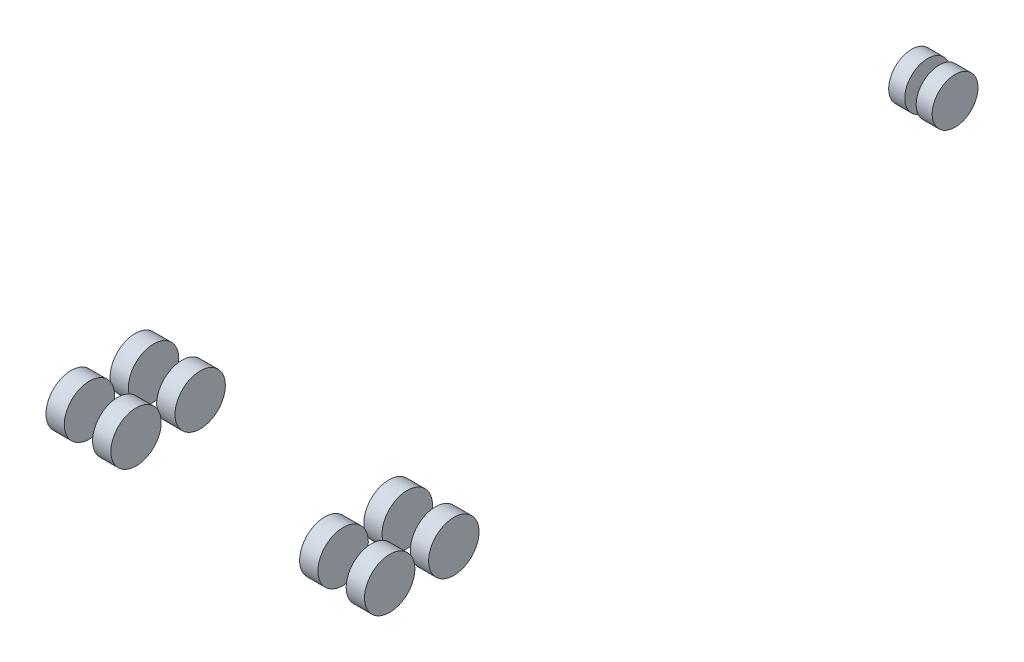
ISO-10303-21;
HEADER;
FILE_DESCRIPTION(('STEP AP214'),'2;1');
FILE_NAME('part.step','',(''),(''),'','','');
FILE_SCHEMA(('AUTOMOTIVE_DESIGN { 1 0 10303 214 1 1 1 1 }'));
ENDSEC;
DATA;
#1=APPLICATION_CONTEXT('core data for automotive mechanical design processes');
#2=APPLICATION_PROTOCOL_DEFINITION('international standard','automotive_design',2000,#1);
#3=PRODUCT_CONTEXT('',#1,'mechanical');
#4=PRODUCT('Part','Part','',(#3));
#5=PRODUCT_RELATED_PRODUCT_CATEGORY('part','',(#4));
#6=PRODUCT_DEFINITION_FORMATION('','',#4);
#7=PRODUCT_DEFINITION_CONTEXT('part definition',#1,'design');
#8=PRODUCT_DEFINITION('design','',#6,#7);
#9=PRODUCT_DEFINITION_SHAPE('','',#8);
#10=(LENGTH_UNIT() NAMED_UNIT(*) SI_UNIT(.MILLI.,.METRE.));
#11=(NAMED_UNIT(*) PLANE_ANGLE_UNIT() SI_UNIT($,.RADIAN.));
#12=(NAMED_UNIT(*) SI_UNIT($,.STERADIAN.) SOLID_ANGLE_UNIT());
#13=UNCERTAINTY_MEASURE_WITH_UNIT(LENGTH_MEASURE(1.E-05),#10,'distance_accuracy_value','');
#14=(GEOMETRIC_REPRESENTATION_CONTEXT(3) GLOBAL_UNCERTAINTY_ASSIGNED_CONTEXT((#13)) GLOBAL_UNIT_ASSIGNED_CONTEXT((#10,
#11,#12)) REPRESENTATION_CONTEXT('',''));
#15=CARTESIAN_POINT('',(0.,0.,0.));
#16=DIRECTION('',(0.,0.,1.));
#17=DIRECTION('',(1.,0.,0.));
#18=AXIS2_PLACEMENT_3D('',#15,#16,#17);
#19=CARTESIAN_POINT('',(127.,508.,-12192.));
#20=DIRECTION('',(1.,0.,0.));
#21=DIRECTION('',(0.,0.,-1.));
#22=AXIS2_PLACEMENT_3D('',#19,#20,#21);
#23=CYLINDRICAL_SURFACE('',#22,507.999999999999);
#24=CARTESIAN_POINT('',(127.,508.,-12192.));
#25=DIRECTION('',(1.,0.,0.));
#26=DIRECTION('',(0.,0.,-1.));
#27=AXIS2_PLACEMENT_3D('',#24,#25,#26);
#28=CIRCLE('',#27,507.999999999999);
#29=CARTESIAN_POINT('',(127.,508.,-12700.));
#30=VERTEX_POINT('',#29);
#31=EDGE_CURVE('E11',#30,#30,#28,.T.);
#32=CARTESIAN_POINT('',(482.6,508.,-12192.));
#33=DIRECTION('',(1.,0.,0.));
#34=DIRECTION('',(0.,0.,-1.));
#35=AXIS2_PLACEMENT_3D('',#32,#33,#34);
#36=CIRCLE('',#35,507.999999999999);
#37=CARTESIAN_POINT('',(482.6,508.,-12700.));
#38=VERTEX_POINT('',#37);
#39=EDGE_CURVE('E50',#38,#38,#36,.T.);
#40=CARTESIAN_POINT('',(127.,508.,-12700.));
#41=CARTESIAN_POINT('',(130.704166666667,508.,-12700.));
#42=CARTESIAN_POINT('',(134.408333333333,508.,-12700.));
#43=CARTESIAN_POINT('',(141.816666666667,508.,-12700.));
#44=CARTESIAN_POINT('',(145.520833333333,508.,-12700.));
#45=CARTESIAN_POINT('',(152.929166666667,508.,-12700.));
#46=CARTESIAN_POINT('',(156.633333333333,508.,-12700.));
#47=CARTESIAN_POINT('',(164.041666666667,508.,-12700.));
#48=CARTESIAN_POINT('',(167.745833333333,508.,-12700.));
#49=CARTESIAN_POINT('',(175.154166666667,508.,-12700.));
#50=CARTESIAN_POINT('',(178.858333333333,508.,-12700.));
#51=CARTESIAN_POINT('',(186.266666666667,508.,-12700.));
#52=CARTESIAN_POINT('',(189.970833333333,508.,-12700.));
#53=CARTESIAN_POINT('',(197.379166666667,508.,-12700.));
#54=CARTESIAN_POINT('',(201.083333333333,508.,-12700.));
#55=CARTESIAN_POINT('',(208.491666666667,508.,-12700.));
#56=CARTESIAN_POINT('',(212.195833333333,508.,-12700.));
#57=CARTESIAN_POINT('',(219.604166666667,508.,-12700.));
#58=CARTESIAN_POINT('',(223.308333333333,508.,-12700.));
#59=CARTESIAN_POINT('',(230.716666666667,508.,-12700.));
#60=CARTESIAN_POINT('',(234.420833333333,508.,-12700.));
#61=CARTESIAN_POINT('',(241.829166666667,508.,-12700.));
#62=CARTESIAN_POINT('',(245.533333333333,508.,-12700.));
#63=CARTESIAN_POINT('',(252.941666666667,508.,-12700.));
#64=CARTESIAN_POINT('',(256.645833333333,508.,-12700.));
#65=CARTESIAN_POINT('',(264.054166666667,508.,-12700.));
#66=CARTESIAN_POINT('',(267.758333333333,508.,-12700.));
#67=CARTESIAN_POINT('',(275.166666666667,508.,-12700.));
#68=CARTESIAN_POINT('',(278.870833333333,508.,-12700.));
#69=CARTESIAN_POINT('',(286.279166666667,508.,-12700.));
#70=CARTESIAN_POINT('',(289.983333333333,508.,-12700.));
#71=CARTESIAN_POINT('',(297.391666666667,508.,-12700.));
#72=CARTESIAN_POINT('',(301.095833333333,508.,-12700.));
#73=CARTESIAN_POINT('',(308.504166666667,508.,-12700.));
#74=CARTESIAN_POINT('',(312.208333333333,508.,-12700.));
#75=CARTESIAN_POINT('',(319.616666666667,508.,-12700.));
#76=CARTESIAN_POINT('',(323.320833333333,508.,-12700.));
#77=CARTESIAN_POINT('',(330.729166666667,508.,-12700.));
#78=CARTESIAN_POINT('',(334.433333333333,508.,-12700.));
#79=CARTESIAN_POINT('',(341.841666666667,508.,-12700.));
#80=CARTESIAN_POINT('',(345.545833333333,508.,-12700.));
#81=CARTESIAN_POINT('',(352.954166666667,508.,-12700.));
#82=CARTESIAN_POINT('',(356.658333333333,508.,-12700.));
#83=CARTESIAN_POINT('',(364.066666666667,508.,-12700.));
#84=CARTESIAN_POINT('',(367.770833333333,508.,-12700.));
#85=CARTESIAN_POINT('',(375.179166666667,508.,-12700.));
#86=CARTESIAN_POINT('',(378.883333333333,508.,-12700.));
#87=CARTESIAN_POINT('',(386.291666666667,508.,-12700.));
#88=CARTESIAN_POINT('',(389.995833333333,508.,-12700.));
#89=CARTESIAN_POINT('',(397.404166666667,508.,-12700.));
#90=CARTESIAN_POINT('',(401.108333333333,508.,-12700.));
#91=CARTESIAN_POINT('',(408.516666666667,508.,-12700.));
#92=CARTESIAN_POINT('',(412.220833333333,508.,-12700.));
#93=CARTESIAN_POINT('',(419.629166666667,508.,-12700.));
#94=CARTESIAN_POINT('',(423.333333333333,508.,-12700.));
#95=CARTESIAN_POINT('',(430.741666666667,508.,-12700.));
#96=CARTESIAN_POINT('',(434.445833333333,508.,-12700.));
#97=CARTESIAN_POINT('',(441.854166666667,508.,-12700.));
#98=CARTESIAN_POINT('',(445.558333333333,508.,-12700.));
#99=CARTESIAN_POINT('',(452.966666666667,508.,-12700.));
#100=CARTESIAN_POINT('',(456.670833333333,508.,-12700.));
#101=CARTESIAN_POINT('',(464.079166666667,508.,-12700.));
#102=CARTESIAN_POINT('',(467.783333333333,508.,-12700.));
#103=CARTESIAN_POINT('',(475.191666666667,508.,-12700.));
#104=CARTESIAN_POINT('',(478.895833333333,508.,-12700.));
#105=CARTESIAN_POINT('',(482.6,508.,-12700.));
#106=B_SPLINE_CURVE_WITH_KNOTS('',3,(#40,#41,#42,#43,#44,#45,#46,#47,#48,#49,#50,#51,#52,#53,
#54,#55,#56,#57,#58,#59,#60,#61,#62,#63,#64,#65,#66,#67,#68,#69,#70,#71,#72,#73,#74,#75,#76,#77,
#78,#79,#80,#81,#82,#83,#84,#85,#86,#87,#88,#89,#90,#91,#92,#93,#94,#95,#96,#97,#98,#99,#100,
#101,#102,#103,#104,#105),.UNSPECIFIED.,.F.,.F.,(4,2,2,2,2,2,2,2,2,2,2,2,2,2,2,2,2,2,2,2,2,2,2,
2,2,2,2,2,2,2,2,2,4),(0.,11.1125,22.225,33.3375,44.45,55.5625,66.675,77.7875,88.9,100.0125,
111.125,122.2375,133.35,144.4625,155.575,166.6875,177.8,188.9125,200.025,211.1375,222.25,
233.3625,244.475,255.5875,266.7,277.8125,288.925,300.0375,311.15,322.2625,333.375,344.4875,
355.6),.UNSPECIFIED.);
#107=EDGE_CURVE('BSEAM44',#30,#38,#106,.T.);
#108=ORIENTED_EDGE('',*,*,#31,.T.);
#109=ORIENTED_EDGE('',*,*,#39,.F.);
#110=ORIENTED_EDGE('',*,*,#107,.T.);
#111=ORIENTED_EDGE('',*,*,#107,.F.);
#112=EDGE_LOOP('',(#108,#110,#109,#111));
#113=FACE_BOUND('',#112,.T.);
#114=ADVANCED_FACE('F44',(#113),#23,.T.);
#115=CARTESIAN_POINT('',(127.,508.,-12192.));
#116=DIRECTION('',(1.,0.,0.));
#117=DIRECTION('',(0.,0.,-1.));
#118=AXIS2_PLACEMENT_3D('',#115,#116,#117);
#119=PLANE('',#118);
#120=ORIENTED_EDGE('',*,*,#31,.F.);
#121=EDGE_LOOP('',(#120));
#122=FACE_BOUND('',#121,.T.);
#123=ADVANCED_FACE('F59',(#122),#119,.F.);
#124=CARTESIAN_POINT('',(482.6,508.,-12192.));
#125=DIRECTION('',(1.,0.,0.));
#126=DIRECTION('',(0.,0.,-1.));
#127=AXIS2_PLACEMENT_3D('',#124,#125,#126);
#128=PLANE('',#127);
#129=ORIENTED_EDGE('',*,*,#39,.T.);
#130=EDGE_LOOP('',(#129));
#131=FACE_BOUND('',#130,.T.);
#132=ADVANCED_FACE('F56',(#131),#128,.T.);
#133=CLOSED_SHELL('',(#114,#123,#132));
#134=MANIFOLD_SOLID_BREP('B2',#133);
#135=CARTESIAN_POINT('',(-482.6,508.,-12192.));
#136=DIRECTION('',(1.,0.,0.));
#137=DIRECTION('',(0.,0.,-1.));
#138=AXIS2_PLACEMENT_3D('',#135,#136,#137);
#139=CYLINDRICAL_SURFACE('',#138,507.999999999999);
#140=CARTESIAN_POINT('',(-482.6,508.,-12192.));
#141=DIRECTION('',(1.,0.,0.));
#142=DIRECTION('',(0.,0.,-1.));
#143=AXIS2_PLACEMENT_3D('',#140,#141,#142);
#144=CIRCLE('',#143,507.999999999999);
#145=CARTESIAN_POINT('',(-482.6,508.,-12700.));
#146=VERTEX_POINT('',#145);
#147=EDGE_CURVE('E43',#146,#146,#144,.T.);
#148=CARTESIAN_POINT('',(-127.,508.,-12192.));
#149=DIRECTION('',(1.,0.,0.));
#150=DIRECTION('',(0.,0.,-1.));
#151=AXIS2_PLACEMENT_3D('',#148,#149,#150);
#152=CIRCLE('',#151,507.999999999999);
#153=CARTESIAN_POINT('',(-127.,508.,-12700.));
#154=VERTEX_POINT('',#153);
#155=EDGE_CURVE('E105',#154,#154,#152,.T.);
#156=CARTESIAN_POINT('',(-482.6,508.,-12700.));
#157=CARTESIAN_POINT('',(-478.895833333333,508.,-12700.));
#158=CARTESIAN_POINT('',(-475.191666666667,508.,-12700.));
#159=CARTESIAN_POINT('',(-467.783333333333,508.,-12700.));
#160=CARTESIAN_POINT('',(-464.079166666667,508.,-12700.));
#161=CARTESIAN_POINT('',(-456.670833333333,508.,-12700.));
#162=CARTESIAN_POINT('',(-452.966666666667,508.,-12700.));
#163=CARTESIAN_POINT('',(-445.558333333333,508.,-12700.));
#164=CARTESIAN_POINT('',(-441.854166666667,508.,-12700.));
#165=CARTESIAN_POINT('',(-434.445833333333,508.,-12700.));
#166=CARTESIAN_POINT('',(-430.741666666667,508.,-12700.));
#167=CARTESIAN_POINT('',(-423.333333333333,508.,-12700.));
#168=CARTESIAN_POINT('',(-419.629166666667,508.,-12700.));
#169=CARTESIAN_POINT('',(-412.220833333333,508.,-12700.));
#170=CARTESIAN_POINT('',(-408.516666666667,508.,-12700.));
#171=CARTESIAN_POINT('',(-401.108333333333,508.,-12700.));
#172=CARTESIAN_POINT('',(-397.404166666667,508.,-12700.));
#173=CARTESIAN_POINT('',(-389.995833333333,508.,-12700.));
#174=CARTESIAN_POINT('',(-386.291666666667,508.,-12700.));
#175=CARTESIAN_POINT('',(-378.883333333333,508.,-12700.));
#176=CARTESIAN_POINT('',(-375.179166666667,508.,-12700.));
#177=CARTESIAN_POINT('',(-367.770833333333,508.,-12700.));
#178=CARTESIAN_POINT('',(-364.066666666667,508.,-12700.));
#179=CARTESIAN_POINT('',(-356.658333333333,508.,-12700.));
#180=CARTESIAN_POINT('',(-352.954166666667,508.,-12700.));
#181=CARTESIAN_POINT('',(-345.545833333333,508.,-12700.));
#182=CARTESIAN_POINT('',(-341.841666666667,508.,-12700.));
#183=CARTESIAN_POINT('',(-334.433333333333,508.,-12700.));
#184=CARTESIAN_POINT('',(-330.729166666667,508.,-12700.));
#185=CARTESIAN_POINT('',(-323.320833333333,508.,-12700.));
#186=CARTESIAN_POINT('',(-319.616666666667,508.,-12700.));
#187=CARTESIAN_POINT('',(-312.208333333333,508.,-12700.));
#188=CARTESIAN_POINT('',(-308.504166666667,508.,-12700.));
#189=CARTESIAN_POINT('',(-301.095833333333,508.,-12700.));
#190=CARTESIAN_POINT('',(-297.391666666667,508.,-12700.));
#191=CARTESIAN_POINT('',(-289.983333333333,508.,-12700.));
#192=CARTESIAN_POINT('',(-286.279166666667,508.,-12700.));
#193=CARTESIAN_POINT('',(-278.870833333333,508.,-12700.));
#194=CARTESIAN_POINT('',(-275.166666666667,508.,-12700.));
#195=CARTESIAN_POINT('',(-267.758333333333,508.,-12700.));
#196=CARTESIAN_POINT('',(-264.054166666667,508.,-12700.));
#197=CARTESIAN_POINT('',(-256.645833333333,508.,-12700.));
#198=CARTESIAN_POINT('',(-252.941666666667,508.,-12700.));
#199=CARTESIAN_POINT('',(-245.533333333333,508.,-12700.));
#200=CARTESIAN_POINT('',(-241.829166666667,508.,-12700.));
#201=CARTESIAN_POINT('',(-234.420833333333,508.,-12700.));
#202=CARTESIAN_POINT('',(-230.716666666667,508.,-12700.));
#203=CARTESIAN_POINT('',(-223.308333333333,508.,-12700.));
#204=CARTESIAN_POINT('',(-219.604166666667,508.,-12700.));
#205=CARTESIAN_POINT('',(-212.195833333333,508.,-12700.));
#206=CARTESIAN_POINT('',(-208.491666666667,508.,-12700.));
#207=CARTESIAN_POINT('',(-201.083333333333,508.,-12700.));
#208=CARTESIAN_POINT('',(-197.379166666667,508.,-12700.));
#209=CARTESIAN_POINT('',(-189.970833333333,508.,-12700.));
#210=CARTESIAN_POINT('',(-186.266666666667,508.,-12700.));
#211=CARTESIAN_POINT('',(-178.858333333333,508.,-12700.));
#212=CARTESIAN_POINT('',(-175.154166666667,508.,-12700.));
#213=CARTESIAN_POINT('',(-167.745833333333,508.,-12700.));
#214=CARTESIAN_POINT('',(-164.041666666667,508.,-12700.));
#215=CARTESIAN_POINT('',(-156.633333333333,508.,-12700.));
#216=CARTESIAN_POINT('',(-152.929166666667,508.,-12700.));
#217=CARTESIAN_POINT('',(-145.520833333333,508.,-12700.));
#218=CARTESIAN_POINT('',(-141.816666666667,508.,-12700.));
#219=CARTESIAN_POINT('',(-134.408333333333,508.,-12700.));
#220=CARTESIAN_POINT('',(-130.704166666667,508.,-12700.));
#221=CARTESIAN_POINT('',(-127.,508.,-12700.));
#222=B_SPLINE_CURVE_WITH_KNOTS('',3,(#156,#157,#158,#159,#160,#161,#162,#163,#164,#165,#166,
#167,#168,#169,#170,#171,#172,#173,#174,#175,#176,#177,#178,#179,#180,#181,#182,#183,#184,#185,
#186,#187,#188,#189,#190,#191,#192,#193,#194,#195,#196,#197,#198,#199,#200,#201,#202,#203,#204,
#205,#206,#207,#208,#209,#210,#211,#212,#213,#214,#215,#216,#217,#218,#219,#220,#221),
.UNSPECIFIED.,.F.,.F.,(4,2,2,2,2,2,2,2,2,2,2,2,2,2,2,2,2,2,2,2,2,2,2,2,2,2,2,2,2,2,2,2,4),(0.,
11.1125,22.2250000000001,33.3375,44.45,55.5625000000001,66.675,77.7875000000001,
88.9000000000001,100.0125,111.125,122.2375,133.35,144.4625,155.575,166.6875,177.8,188.9125,
200.025,211.1375,222.25,233.3625,244.475,255.5875,266.7,277.8125,288.925,300.0375,311.15,
322.2625,333.375,344.4875,355.6),.UNSPECIFIED.);
#223=EDGE_CURVE('BSEAM99',#146,#154,#222,.T.);
#224=ORIENTED_EDGE('',*,*,#147,.T.);
#225=ORIENTED_EDGE('',*,*,#155,.F.);
#226=ORIENTED_EDGE('',*,*,#223,.T.);
#227=ORIENTED_EDGE('',*,*,#223,.F.);
#228=EDGE_LOOP('',(#224,#226,#225,#227));
#229=FACE_BOUND('',#228,.T.);
#230=ADVANCED_FACE('F99',(#229),#139,.T.);
#231=CARTESIAN_POINT('',(-482.6,508.,-12192.));
#232=DIRECTION('',(1.,0.,0.));
#233=DIRECTION('',(0.,0.,-1.));
#234=AXIS2_PLACEMENT_3D('',#231,#232,#233);
#235=PLANE('',#234);
#236=ORIENTED_EDGE('',*,*,#147,.F.);
#237=EDGE_LOOP('',(#236));
#238=FACE_BOUND('',#237,.T.);
#239=ADVANCED_FACE('F114',(#238),#235,.F.);
#240=CARTESIAN_POINT('',(-127.,508.,-12192.));
#241=DIRECTION('',(1.,0.,0.));
#242=DIRECTION('',(0.,0.,-1.));
#243=AXIS2_PLACEMENT_3D('',#240,#241,#242);
#244=PLANE('',#243);
#245=ORIENTED_EDGE('',*,*,#155,.T.);
#246=EDGE_LOOP('',(#245));
#247=FACE_BOUND('',#246,.T.);
#248=ADVANCED_FACE('F111',(#247),#244,.T.);
#249=CLOSED_SHELL('',(#230,#239,#248));
#250=MANIFOLD_SOLID_BREP('B6',#249);
#251=CARTESIAN_POINT('',(3126.85028932855,558.8,1978.3552));
#252=DIRECTION('',(1.,0.,0.));
#253=DIRECTION('',(0.,0.,-1.));
#254=AXIS2_PLACEMENT_3D('',#251,#252,#253);
#255=CYLINDRICAL_SURFACE('',#254,558.8);
#256=CARTESIAN_POINT('',(3126.85028932855,558.8,1978.3552));
#257=DIRECTION('',(1.,0.,0.));
#258=DIRECTION('',(0.,0.,-1.));
#259=AXIS2_PLACEMENT_3D('',#256,#257,#258);
#260=CIRCLE('',#259,558.8);
#261=CARTESIAN_POINT('',(3126.85028932855,558.8,1419.5552));
#262=VERTEX_POINT('',#261);
#263=EDGE_CURVE('E161',#262,#262,#260,.T.);
#264=ORIENTED_EDGE('',*,*,#263,.T.);
#265=EDGE_LOOP('',(#264));
#266=FACE_BOUND('',#265,.T.);
#267=CARTESIAN_POINT('',(3533.25028932855,558.8,1978.3552));
#268=DIRECTION('',(1.,0.,0.));
#269=DIRECTION('',(0.,0.,-1.));
#270=AXIS2_PLACEMENT_3D('',#267,#268,#269);
#271=CIRCLE('',#270,558.8);
#272=CARTESIAN_POINT('',(3533.25028932855,558.8,1419.5552));
#273=VERTEX_POINT('',#272);
#274=EDGE_CURVE('E98',#273,#273,#271,.T.);
#275=ORIENTED_EDGE('',*,*,#274,.F.);
#276=EDGE_LOOP('',(#275));
#277=FACE_BOUND('',#276,.T.);
#278=ADVANCED_FACE('F154',(#266,#277),#255,.T.);
#279=CARTESIAN_POINT('',(3126.85028932855,558.8,1978.3552));
#280=DIRECTION('',(1.,0.,0.));
#281=DIRECTION('',(0.,0.,-1.));
#282=AXIS2_PLACEMENT_3D('',#279,#280,#281);
#283=PLANE('',#282);
#284=ORIENTED_EDGE('',*,*,#263,.F.);
#285=EDGE_LOOP('',(#284));
#286=FACE_BOUND('',#285,.T.);
#287=ADVANCED_FACE('F169',(#286),#283,.F.);
#288=CARTESIAN_POINT('',(3533.25028932855,558.8,1978.3552));
#289=DIRECTION('',(1.,0.,0.));
#290=DIRECTION('',(0.,0.,-1.));
#291=AXIS2_PLACEMENT_3D('',#288,#289,#290);
#292=PLANE('',#291);
#293=ORIENTED_EDGE('',*,*,#274,.T.);
#294=EDGE_LOOP('',(#293));
#295=FACE_BOUND('',#294,.T.);
#296=ADVANCED_FACE('F156',(#295),#292,.T.);
#297=CLOSED_SHELL('',(#278,#287,#296));
#298=MANIFOLD_SOLID_BREP('B38',#297);
#299=CARTESIAN_POINT('',(3126.85028932855,558.8,3400.7552));
#300=DIRECTION('',(1.,0.,0.));
#301=DIRECTION('',(0.,0.,-1.));
#302=AXIS2_PLACEMENT_3D('',#299,#300,#301);
#303=CYLINDRICAL_SURFACE('',#302,558.8);
#304=CARTESIAN_POINT('',(3126.85028932855,558.8,3400.7552));
#305=DIRECTION('',(1.,0.,0.));
#306=DIRECTION('',(0.,0.,-1.));
#307=AXIS2_PLACEMENT_3D('',#304,#305,#306);
#308=CIRCLE('',#307,558.8);
#309=CARTESIAN_POINT('',(3126.85028932855,558.8,2841.9552));
#310=VERTEX_POINT('',#309);
#311=EDGE_CURVE('E153',#310,#310,#308,.T.);
#312=ORIENTED_EDGE('',*,*,#311,.T.);
#313=EDGE_LOOP('',(#312));
#314=FACE_BOUND('',#313,.T.);
#315=CARTESIAN_POINT('',(3533.25028932855,558.8,3400.7552));
#316=DIRECTION('',(1.,0.,0.));
#317=DIRECTION('',(0.,0.,-1.));
#318=AXIS2_PLACEMENT_3D('',#315,#316,#317);
#319=CIRCLE('',#318,558.8);
#320=CARTESIAN_POINT('',(3533.25028932855,558.8,2841.9552));
#321=VERTEX_POINT('',#320);
#322=EDGE_CURVE('E215',#321,#321,#319,.T.);
#323=ORIENTED_EDGE('',*,*,#322,.F.);
#324=EDGE_LOOP('',(#323));
#325=FACE_BOUND('',#324,.T.);
#326=ADVANCED_FACE('F209',(#314,#325),#303,.T.);
#327=CARTESIAN_POINT('',(3126.85028932855,558.8,3400.7552));
#328=DIRECTION('',(1.,0.,0.));
#329=DIRECTION('',(0.,0.,-1.));
#330=AXIS2_PLACEMENT_3D('',#327,#328,#329);
#331=PLANE('',#330);
#332=ORIENTED_EDGE('',*,*,#311,.F.);
#333=EDGE_LOOP('',(#332));
#334=FACE_BOUND('',#333,.T.);
#335=ADVANCED_FACE('F224',(#334),#331,.F.);
#336=CARTESIAN_POINT('',(3533.25028932855,558.8,3400.7552));
#337=DIRECTION('',(1.,0.,0.));
#338=DIRECTION('',(0.,0.,-1.));
#339=AXIS2_PLACEMENT_3D('',#336,#337,#338);
#340=PLANE('',#339);
#341=ORIENTED_EDGE('',*,*,#322,.T.);
#342=EDGE_LOOP('',(#341));
#343=FACE_BOUND('',#342,.T.);
#344=ADVANCED_FACE('F221',(#343),#340,.T.);
#345=CLOSED_SHELL('',(#326,#335,#344));
#346=MANIFOLD_SOLID_BREP('B93',#345);
#347=CARTESIAN_POINT('',(2093.41619749383,558.8,3400.7552));
#348=DIRECTION('',(1.,0.,0.));
#349=DIRECTION('',(0.,0.,-1.));
#350=AXIS2_PLACEMENT_3D('',#347,#348,#349);
#351=CYLINDRICAL_SURFACE('',#350,558.8);
#352=CARTESIAN_POINT('',(2093.41619749383,558.8,3400.7552));
#353=DIRECTION('',(1.,0.,0.));
#354=DIRECTION('',(0.,0.,-1.));
#355=AXIS2_PLACEMENT_3D('',#352,#353,#354);
#356=CIRCLE('',#355,558.8);
#357=CARTESIAN_POINT('',(2093.41619749383,558.8,2841.9552));
#358=VERTEX_POINT('',#357);
#359=EDGE_CURVE('E271',#358,#358,#356,.T.);
#360=ORIENTED_EDGE('',*,*,#359,.T.);
#361=EDGE_LOOP('',(#360));
#362=FACE_BOUND('',#361,.T.);
#363=CARTESIAN_POINT('',(2499.81619749383,558.8,3400.7552));
#364=DIRECTION('',(1.,0.,0.));
#365=DIRECTION('',(0.,0.,-1.));
#366=AXIS2_PLACEMENT_3D('',#363,#364,#365);
#367=CIRCLE('',#366,558.8);
#368=CARTESIAN_POINT('',(2499.81619749383,558.8,2841.9552));
#369=VERTEX_POINT('',#368);
#370=EDGE_CURVE('E208',#369,#369,#367,.T.);
#371=ORIENTED_EDGE('',*,*,#370,.F.);
#372=EDGE_LOOP('',(#371));
#373=FACE_BOUND('',#372,.T.);
#374=ADVANCED_FACE('F264',(#362,#373),#351,.T.);
#375=CARTESIAN_POINT('',(2093.41619749383,558.8,3400.7552));
#376=DIRECTION('',(1.,0.,0.));
#377=DIRECTION('',(0.,0.,-1.));
#378=AXIS2_PLACEMENT_3D('',#375,#376,#377);
#379=PLANE('',#378);
#380=ORIENTED_EDGE('',*,*,#359,.F.);
#381=EDGE_LOOP('',(#380));
#382=FACE_BOUND('',#381,.T.);
#383=ADVANCED_FACE('F279',(#382),#379,.F.);
#384=CARTESIAN_POINT('',(2499.81619749383,558.8,3400.7552));
#385=DIRECTION('',(1.,0.,0.));
#386=DIRECTION('',(0.,0.,-1.));
#387=AXIS2_PLACEMENT_3D('',#384,#385,#386);
#388=PLANE('',#387);
#389=ORIENTED_EDGE('',*,*,#370,.T.);
#390=EDGE_LOOP('',(#389));
#391=FACE_BOUND('',#390,.T.);
#392=ADVANCED_FACE('F266',(#391),#388,.T.);
#393=CLOSED_SHELL('',(#374,#383,#392));
#394=MANIFOLD_SOLID_BREP('B148',#393);
#395=CARTESIAN_POINT('',(2093.41619749383,558.8,1978.3552));
#396=DIRECTION('',(1.,0.,0.));
#397=DIRECTION('',(0.,0.,-1.));
#398=AXIS2_PLACEMENT_3D('',#395,#396,#397);
#399=CYLINDRICAL_SURFACE('',#398,558.8);
#400=CARTESIAN_POINT('',(2093.41619749383,558.8,1978.3552));
#401=DIRECTION('',(1.,0.,0.));
#402=DIRECTION('',(0.,0.,-1.));
#403=AXIS2_PLACEMENT_3D('',#400,#401,#402);
#404=CIRCLE('',#403,558.8);
#405=CARTESIAN_POINT('',(2093.41619749383,558.8,1419.5552));
#406=VERTEX_POINT('',#405);
#407=EDGE_CURVE('E263',#406,#406,#404,.T.);
#408=ORIENTED_EDGE('',*,*,#407,.T.);
#409=EDGE_LOOP('',(#408));
#410=FACE_BOUND('',#409,.T.);
#411=CARTESIAN_POINT('',(2499.81619749383,558.8,1978.3552));
#412=DIRECTION('',(1.,0.,0.));
#413=DIRECTION('',(0.,0.,-1.));
#414=AXIS2_PLACEMENT_3D('',#411,#412,#413);
#415=CIRCLE('',#414,558.8);
#416=CARTESIAN_POINT('',(2499.81619749383,558.8,1419.5552));
#417=VERTEX_POINT('',#416);
#418=EDGE_CURVE('E325',#417,#417,#415,.T.);
#419=ORIENTED_EDGE('',*,*,#418,.F.);
#420=EDGE_LOOP('',(#419));
#421=FACE_BOUND('',#420,.T.);
#422=ADVANCED_FACE('F319',(#410,#421),#399,.T.);
#423=CARTESIAN_POINT('',(2093.41619749383,558.8,1978.3552));
#424=DIRECTION('',(1.,0.,0.));
#425=DIRECTION('',(0.,0.,-1.));
#426=AXIS2_PLACEMENT_3D('',#423,#424,#425);
#427=PLANE('',#426);
#428=ORIENTED_EDGE('',*,*,#407,.F.);
#429=EDGE_LOOP('',(#428));
#430=FACE_BOUND('',#429,.T.);
#431=ADVANCED_FACE('F334',(#430),#427,.F.);
#432=CARTESIAN_POINT('',(2499.81619749383,558.8,1978.3552));
#433=DIRECTION('',(1.,0.,0.));
#434=DIRECTION('',(0.,0.,-1.));
#435=AXIS2_PLACEMENT_3D('',#432,#433,#434);
#436=PLANE('',#435);
#437=ORIENTED_EDGE('',*,*,#418,.T.);
#438=EDGE_LOOP('',(#437));
#439=FACE_BOUND('',#438,.T.);
#440=ADVANCED_FACE('F331',(#439),#436,.T.);
#441=CLOSED_SHELL('',(#422,#431,#440));
#442=MANIFOLD_SOLID_BREP('B203',#441);
#443=CARTESIAN_POINT('',(-3533.25028932854,558.8,1978.3552));
#444=DIRECTION('',(1.,0.,0.));
#445=DIRECTION('',(0.,0.,-1.));
#446=AXIS2_PLACEMENT_3D('',#443,#444,#445);
#447=CYLINDRICAL_SURFACE('',#446,558.8);
#448=CARTESIAN_POINT('',(-3533.25028932854,558.8,1978.3552));
#449=DIRECTION('',(1.,0.,0.));
#450=DIRECTION('',(0.,0.,-1.));
#451=AXIS2_PLACEMENT_3D('',#448,#449,#450);
#452=CIRCLE('',#451,558.8);
#453=CARTESIAN_POINT('',(-3533.25028932854,558.8,1419.5552));
#454=VERTEX_POINT('',#453);
#455=EDGE_CURVE('E381',#454,#454,#452,.T.);
#456=ORIENTED_EDGE('',*,*,#455,.T.);
#457=EDGE_LOOP('',(#456));
#458=FACE_BOUND('',#457,.T.);
#459=CARTESIAN_POINT('',(-3126.85028932854,558.8,1978.3552));
#460=DIRECTION('',(1.,0.,0.));
#461=DIRECTION('',(0.,0.,-1.));
#462=AXIS2_PLACEMENT_3D('',#459,#460,#461);
#463=CIRCLE('',#462,558.8);
#464=CARTESIAN_POINT('',(-3126.85028932854,558.8,1419.5552));
#465=VERTEX_POINT('',#464);
#466=EDGE_CURVE('E318',#465,#465,#463,.T.);
#467=ORIENTED_EDGE('',*,*,#466,.F.);
#468=EDGE_LOOP('',(#467));
#469=FACE_BOUND('',#468,.T.);
#470=ADVANCED_FACE('F374',(#458,#469),#447,.T.);
#471=CARTESIAN_POINT('',(-3533.25028932854,558.8,1978.3552));
#472=DIRECTION('',(1.,0.,0.));
#473=DIRECTION('',(0.,0.,-1.));
#474=AXIS2_PLACEMENT_3D('',#471,#472,#473);
#475=PLANE('',#474);
#476=ORIENTED_EDGE('',*,*,#455,.F.);
#477=EDGE_LOOP('',(#476));
#478=FACE_BOUND('',#477,.T.);
#479=ADVANCED_FACE('F389',(#478),#475,.F.);
#480=CARTESIAN_POINT('',(-3126.85028932854,558.8,1978.3552));
#481=DIRECTION('',(1.,0.,0.));
#482=DIRECTION('',(0.,0.,-1.));
#483=AXIS2_PLACEMENT_3D('',#480,#481,#482);
#484=PLANE('',#483);
#485=ORIENTED_EDGE('',*,*,#466,.T.);
#486=EDGE_LOOP('',(#485));
#487=FACE_BOUND('',#486,.T.);
#488=ADVANCED_FACE('F376',(#487),#484,.T.);
#489=CLOSED_SHELL('',(#470,#479,#488));
#490=MANIFOLD_SOLID_BREP('B258',#489);
#491=CARTESIAN_POINT('',(-3533.25028932854,558.8,3400.7552));
#492=DIRECTION('',(1.,0.,0.));
#493=DIRECTION('',(0.,0.,-1.));
#494=AXIS2_PLACEMENT_3D('',#491,#492,#493);
#495=CYLINDRICAL_SURFACE('',#494,558.8);
#496=CARTESIAN_POINT('',(-3533.25028932854,558.8,3400.7552));
#497=DIRECTION('',(1.,0.,0.));
#498=DIRECTION('',(0.,0.,-1.));
#499=AXIS2_PLACEMENT_3D('',#496,#497,#498);
#500=CIRCLE('',#499,558.8);
#501=CARTESIAN_POINT('',(-3533.25028932854,558.8,2841.9552));
#502=VERTEX_POINT('',#501);
#503=EDGE_CURVE('E373',#502,#502,#500,.T.);
#504=ORIENTED_EDGE('',*,*,#503,.T.);
#505=EDGE_LOOP('',(#504));
#506=FACE_BOUND('',#505,.T.);
#507=CARTESIAN_POINT('',(-3126.85028932854,558.8,3400.7552));
#508=DIRECTION('',(1.,0.,0.));
#509=DIRECTION('',(0.,0.,-1.));
#510=AXIS2_PLACEMENT_3D('',#507,#508,#509);
#511=CIRCLE('',#510,558.8);
#512=CARTESIAN_POINT('',(-3126.85028932854,558.8,2841.9552));
#513=VERTEX_POINT('',#512);
#514=EDGE_CURVE('E435',#513,#513,#511,.T.);
#515=ORIENTED_EDGE('',*,*,#514,.F.);
#516=EDGE_LOOP('',(#515));
#517=FACE_BOUND('',#516,.T.);
#518=ADVANCED_FACE('F429',(#506,#517),#495,.T.);
#519=CARTESIAN_POINT('',(-3533.25028932854,558.8,3400.7552));
#520=DIRECTION('',(1.,0.,0.));
#521=DIRECTION('',(0.,0.,-1.));
#522=AXIS2_PLACEMENT_3D('',#519,#520,#521);
#523=PLANE('',#522);
#524=ORIENTED_EDGE('',*,*,#503,.F.);
#525=EDGE_LOOP('',(#524));
#526=FACE_BOUND('',#525,.T.);
#527=ADVANCED_FACE('F444',(#526),#523,.F.);
#528=CARTESIAN_POINT('',(-3126.85028932854,558.8,3400.7552));
#529=DIRECTION('',(1.,0.,0.));
#530=DIRECTION('',(0.,0.,-1.));
#531=AXIS2_PLACEMENT_3D('',#528,#529,#530);
#532=PLANE('',#531);
#533=ORIENTED_EDGE('',*,*,#514,.T.);
#534=EDGE_LOOP('',(#533));
#535=FACE_BOUND('',#534,.T.);
#536=ADVANCED_FACE('F441',(#535),#532,.T.);
#537=CLOSED_SHELL('',(#518,#527,#536));
#538=MANIFOLD_SOLID_BREP('B313',#537);
#539=CARTESIAN_POINT('',(-2499.81619749377,558.8,1978.3552));
#540=DIRECTION('',(1.,0.,0.));
#541=DIRECTION('',(0.,0.,-1.));
#542=AXIS2_PLACEMENT_3D('',#539,#540,#541);
#543=CYLINDRICAL_SURFACE('',#542,558.8);
#544=CARTESIAN_POINT('',(-2499.81619749377,558.8,1978.3552));
#545=DIRECTION('',(1.,0.,0.));
#546=DIRECTION('',(0.,0.,-1.));
#547=AXIS2_PLACEMENT_3D('',#544,#545,#546);
#548=CIRCLE('',#547,558.8);
#549=CARTESIAN_POINT('',(-2499.81619749377,558.8,1419.5552));
#550=VERTEX_POINT('',#549);
#551=EDGE_CURVE('E490',#550,#550,#548,.T.);
#552=ORIENTED_EDGE('',*,*,#551,.T.);
#553=EDGE_LOOP('',(#552));
#554=FACE_BOUND('',#553,.T.);
#555=CARTESIAN_POINT('',(-2093.41619749377,558.8,1978.3552));
#556=DIRECTION('',(1.,0.,0.));
#557=DIRECTION('',(0.,0.,-1.));
#558=AXIS2_PLACEMENT_3D('',#555,#556,#557);
#559=CIRCLE('',#558,558.8);
#560=CARTESIAN_POINT('',(-2093.41619749377,558.8,1419.5552));
#561=VERTEX_POINT('',#560);
#562=EDGE_CURVE('E428',#561,#561,#559,.T.);
#563=ORIENTED_EDGE('',*,*,#562,.F.);
#564=EDGE_LOOP('',(#563));
#565=FACE_BOUND('',#564,.T.);
#566=ADVANCED_FACE('F483',(#554,#565),#543,.T.);
#567=CARTESIAN_POINT('',(-2499.81619749377,558.8,1978.3552));
#568=DIRECTION('',(1.,0.,0.));
#569=DIRECTION('',(0.,0.,-1.));
#570=AXIS2_PLACEMENT_3D('',#567,#568,#569);
#571=PLANE('',#570);
#572=ORIENTED_EDGE('',*,*,#551,.F.);
#573=EDGE_LOOP('',(#572));
#574=FACE_BOUND('',#573,.T.);
#575=ADVANCED_FACE('F498',(#574),#571,.F.);
#576=CARTESIAN_POINT('',(-2093.41619749377,558.8,1978.3552));
#577=DIRECTION('',(1.,0.,0.));
#578=DIRECTION('',(0.,0.,-1.));
#579=AXIS2_PLACEMENT_3D('',#576,#577,#578);
#580=PLANE('',#579);
#581=ORIENTED_EDGE('',*,*,#562,.T.);
#582=EDGE_LOOP('',(#581));
#583=FACE_BOUND('',#582,.T.);
#584=ADVANCED_FACE('F485',(#583),#580,.T.);
#585=CLOSED_SHELL('',(#566,#575,#584));
#586=MANIFOLD_SOLID_BREP('B368',#585);
#587=CARTESIAN_POINT('',(-2499.81619749377,558.8,3400.7552));
#588=DIRECTION('',(1.,0.,0.));
#589=DIRECTION('',(0.,0.,-1.));
#590=AXIS2_PLACEMENT_3D('',#587,#588,#589);
#591=CYLINDRICAL_SURFACE('',#590,558.8);
#592=CARTESIAN_POINT('',(-2499.81619749377,558.8,3400.7552));
#593=DIRECTION('',(1.,0.,0.));
#594=DIRECTION('',(0.,0.,-1.));
#595=AXIS2_PLACEMENT_3D('',#592,#593,#594);
#596=CIRCLE('',#595,558.8);
#597=CARTESIAN_POINT('',(-2499.81619749377,558.8,2841.9552));
#598=VERTEX_POINT('',#597);
#599=EDGE_CURVE('E482',#598,#598,#596,.T.);
#600=ORIENTED_EDGE('',*,*,#599,.T.);
#601=EDGE_LOOP('',(#600));
#602=FACE_BOUND('',#601,.T.);
#603=CARTESIAN_POINT('',(-2093.41619749377,558.8,3400.7552));
#604=DIRECTION('',(1.,0.,0.));
#605=DIRECTION('',(0.,0.,-1.));
#606=AXIS2_PLACEMENT_3D('',#603,#604,#605);
#607=CIRCLE('',#606,558.8);
#608=CARTESIAN_POINT('',(-2093.41619749377,558.8,2841.9552));
#609=VERTEX_POINT('',#608);
#610=EDGE_CURVE('E536',#609,#609,#607,.T.);
#611=ORIENTED_EDGE('',*,*,#610,.F.);
#612=EDGE_LOOP('',(#611));
#613=FACE_BOUND('',#612,.T.);
#614=ADVANCED_FACE('F530',(#602,#613),#591,.T.);
#615=CARTESIAN_POINT('',(-2499.81619749377,558.8,3400.7552));
#616=DIRECTION('',(1.,0.,0.));
#617=DIRECTION('',(0.,0.,-1.));
#618=AXIS2_PLACEMENT_3D('',#615,#616,#617);
#619=PLANE('',#618);
#620=ORIENTED_EDGE('',*,*,#599,.F.);
#621=EDGE_LOOP('',(#620));
#622=FACE_BOUND('',#621,.T.);
#623=ADVANCED_FACE('F545',(#622),#619,.F.);
#624=CARTESIAN_POINT('',(-2093.41619749377,558.8,3400.7552));
#625=DIRECTION('',(1.,0.,0.));
#626=DIRECTION('',(0.,0.,-1.));
#627=AXIS2_PLACEMENT_3D('',#624,#625,#626);
#628=PLANE('',#627);
#629=ORIENTED_EDGE('',*,*,#610,.T.);
#630=EDGE_LOOP('',(#629));
#631=FACE_BOUND('',#630,.T.);
#632=ADVANCED_FACE('F542',(#631),#628,.T.);
#633=CLOSED_SHELL('',(#614,#623,#632));
#634=MANIFOLD_SOLID_BREP('B423',#633);
#635=ADVANCED_BREP_SHAPE_REPRESENTATION('',(#18,#134,#250,#298,#346,#394,#442,#490,#538,#586,
#634),#14);
#636=SHAPE_DEFINITION_REPRESENTATION(#9,#635);
ENDSEC;
END-ISO-10303-21;
